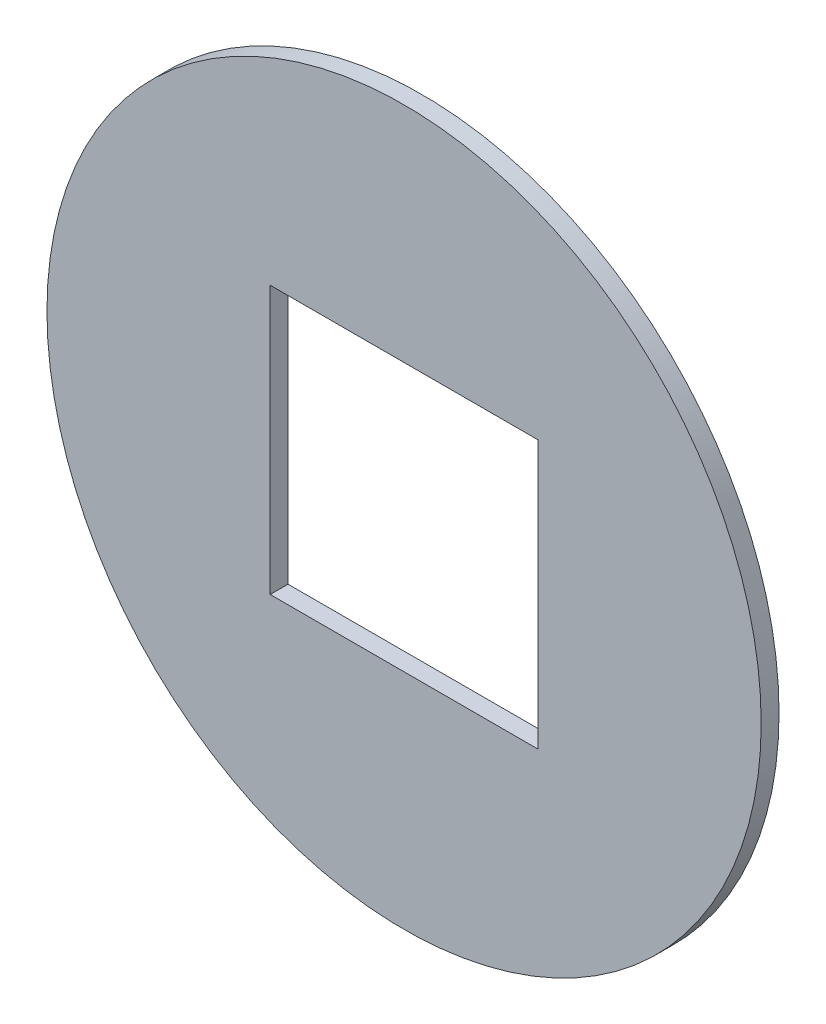
ISO-10303-21;
HEADER;
FILE_DESCRIPTION(('STEP AP214'),'2;1');
FILE_NAME('part.step','',(''),(''),'','','');
FILE_SCHEMA(('AUTOMOTIVE_DESIGN { 1 0 10303 214 1 1 1 1 }'));
ENDSEC;
DATA;
#1=APPLICATION_CONTEXT('core data for automotive mechanical design processes');
#2=APPLICATION_PROTOCOL_DEFINITION('international standard','automotive_design',2000,#1);
#3=PRODUCT_CONTEXT('',#1,'mechanical');
#4=PRODUCT('Part','Part','',(#3));
#5=PRODUCT_RELATED_PRODUCT_CATEGORY('part','',(#4));
#6=PRODUCT_DEFINITION_FORMATION('','',#4);
#7=PRODUCT_DEFINITION_CONTEXT('part definition',#1,'design');
#8=PRODUCT_DEFINITION('design','',#6,#7);
#9=PRODUCT_DEFINITION_SHAPE('','',#8);
#10=(LENGTH_UNIT() NAMED_UNIT(*) SI_UNIT(.MILLI.,.METRE.));
#11=(NAMED_UNIT(*) PLANE_ANGLE_UNIT() SI_UNIT($,.RADIAN.));
#12=(NAMED_UNIT(*) SI_UNIT($,.STERADIAN.) SOLID_ANGLE_UNIT());
#13=UNCERTAINTY_MEASURE_WITH_UNIT(LENGTH_MEASURE(1.E-05),#10,'distance_accuracy_value','');
#14=(GEOMETRIC_REPRESENTATION_CONTEXT(3) GLOBAL_UNCERTAINTY_ASSIGNED_CONTEXT((#13)) GLOBAL_UNIT_ASSIGNED_CONTEXT((#10,
#11,#12)) REPRESENTATION_CONTEXT('',''));
#15=CARTESIAN_POINT('',(0.,0.,0.));
#16=DIRECTION('',(0.,0.,1.));
#17=DIRECTION('',(1.,0.,0.));
#18=AXIS2_PLACEMENT_3D('',#15,#16,#17);
#19=CARTESIAN_POINT('',(0.,0.,0.5));
#20=DIRECTION('',(0.,0.,1.));
#21=DIRECTION('',(1.,0.,0.));
#22=AXIS2_PLACEMENT_3D('',#19,#20,#21);
#23=PLANE('',#22);
#24=CARTESIAN_POINT('',(0.,0.,0.5));
#25=DIRECTION('',(0.,0.,1.));
#26=DIRECTION('',(1.,0.,0.));
#27=AXIS2_PLACEMENT_3D('',#24,#25,#26);
#28=CIRCLE('',#27,10.);
#29=CARTESIAN_POINT('',(10.,0.,0.5));
#30=VERTEX_POINT('',#29);
#31=EDGE_CURVE('E11',#30,#30,#28,.T.);
#32=ORIENTED_EDGE('',*,*,#31,.T.);
#33=EDGE_LOOP('',(#32));
#34=FACE_BOUND('',#33,.T.);
#35=DIRECTION('',(0.,-1.,0.));
#36=VECTOR('',#35,1.);
#37=CARTESIAN_POINT('',(3.75,3.75,0.5));
#38=LINE('',#37,#36);
#39=CARTESIAN_POINT('',(3.75,3.75,0.5));
#40=VERTEX_POINT('',#39);
#41=CARTESIAN_POINT('',(3.75,-3.75,0.5));
#42=VERTEX_POINT('',#41);
#43=EDGE_CURVE('E91',#40,#42,#38,.T.);
#44=ORIENTED_EDGE('',*,*,#43,.T.);
#45=DIRECTION('',(-1.,0.,0.));
#46=VECTOR('',#45,1.);
#47=CARTESIAN_POINT('',(3.75,-3.75,0.5));
#48=LINE('',#47,#46);
#49=CARTESIAN_POINT('',(-3.75,-3.75,0.5));
#50=VERTEX_POINT('',#49);
#51=EDGE_CURVE('E56',#42,#50,#48,.T.);
#52=ORIENTED_EDGE('',*,*,#51,.T.);
#53=DIRECTION('',(0.,-1.,0.));
#54=VECTOR('',#53,1.);
#55=CARTESIAN_POINT('',(-3.75,3.75,0.5));
#56=LINE('',#55,#54);
#57=CARTESIAN_POINT('',(-3.75,3.75,0.5));
#58=VERTEX_POINT('',#57);
#59=EDGE_CURVE('E97',#58,#50,#56,.T.);
#60=ORIENTED_EDGE('',*,*,#59,.F.);
#61=DIRECTION('',(-1.,0.,0.));
#62=VECTOR('',#61,1.);
#63=CARTESIAN_POINT('',(3.75,3.75,0.5));
#64=LINE('',#63,#62);
#65=EDGE_CURVE('E108',#40,#58,#64,.T.);
#66=ORIENTED_EDGE('',*,*,#65,.F.);
#67=EDGE_LOOP('',(#44,#52,#60,#66));
#68=FACE_BOUND('',#67,.T.);
#69=ADVANCED_FACE('F41',(#34,#68),#23,.T.);
#70=CARTESIAN_POINT('',(0.,0.,0.));
#71=DIRECTION('',(0.,0.,1.));
#72=DIRECTION('',(1.,0.,0.));
#73=AXIS2_PLACEMENT_3D('',#70,#71,#72);
#74=PLANE('',#73);
#75=CARTESIAN_POINT('',(0.,0.,0.));
#76=DIRECTION('',(0.,0.,1.));
#77=DIRECTION('',(1.,0.,0.));
#78=AXIS2_PLACEMENT_3D('',#75,#76,#77);
#79=CIRCLE('',#78,10.);
#80=CARTESIAN_POINT('',(10.,0.,0.));
#81=VERTEX_POINT('',#80);
#82=EDGE_CURVE('E45',#81,#81,#79,.T.);
#83=ORIENTED_EDGE('',*,*,#82,.F.);
#84=EDGE_LOOP('',(#83));
#85=FACE_BOUND('',#84,.T.);
#86=DIRECTION('',(-1.,0.,0.));
#87=VECTOR('',#86,1.);
#88=CARTESIAN_POINT('',(3.75,-3.75,0.));
#89=LINE('',#88,#87);
#90=CARTESIAN_POINT('',(3.75,-3.75,0.));
#91=VERTEX_POINT('',#90);
#92=CARTESIAN_POINT('',(-3.75,-3.75,0.));
#93=VERTEX_POINT('',#92);
#94=EDGE_CURVE('E81',#91,#93,#89,.T.);
#95=ORIENTED_EDGE('',*,*,#94,.F.);
#96=DIRECTION('',(0.,-1.,0.));
#97=VECTOR('',#96,1.);
#98=CARTESIAN_POINT('',(3.75,3.75,0.));
#99=LINE('',#98,#97);
#100=CARTESIAN_POINT('',(3.75,3.75,0.));
#101=VERTEX_POINT('',#100);
#102=EDGE_CURVE('E102',#101,#91,#99,.T.);
#103=ORIENTED_EDGE('',*,*,#102,.F.);
#104=DIRECTION('',(-1.,0.,0.));
#105=VECTOR('',#104,1.);
#106=CARTESIAN_POINT('',(3.75,3.75,0.));
#107=LINE('',#106,#105);
#108=CARTESIAN_POINT('',(-3.75,3.75,0.));
#109=VERTEX_POINT('',#108);
#110=EDGE_CURVE('E64',#101,#109,#107,.T.);
#111=ORIENTED_EDGE('',*,*,#110,.T.);
#112=DIRECTION('',(0.,-1.,0.));
#113=VECTOR('',#112,1.);
#114=CARTESIAN_POINT('',(-3.75,3.75,0.));
#115=LINE('',#114,#113);
#116=EDGE_CURVE('E90',#109,#93,#115,.T.);
#117=ORIENTED_EDGE('',*,*,#116,.T.);
#118=EDGE_LOOP('',(#95,#103,#111,#117));
#119=FACE_BOUND('',#118,.T.);
#120=ADVANCED_FACE('F100',(#85,#119),#74,.F.);
#121=CARTESIAN_POINT('',(0.,0.,0.5));
#122=DIRECTION('',(0.,0.,-1.));
#123=DIRECTION('',(-1.,0.,0.));
#124=AXIS2_PLACEMENT_3D('',#121,#122,#123);
#125=CYLINDRICAL_SURFACE('',#124,10.);
#126=ORIENTED_EDGE('',*,*,#31,.F.);
#127=EDGE_LOOP('',(#126));
#128=FACE_BOUND('',#127,.T.);
#129=ORIENTED_EDGE('',*,*,#82,.T.);
#130=EDGE_LOOP('',(#129));
#131=FACE_BOUND('',#130,.T.);
#132=ADVANCED_FACE('F43',(#128,#131),#125,.T.);
#133=CARTESIAN_POINT('',(3.75,-3.75,0.));
#134=DIRECTION('',(0.,1.,0.));
#135=DIRECTION('',(-1.,0.,0.));
#136=AXIS2_PLACEMENT_3D('',#133,#134,#135);
#137=PLANE('',#136);
#138=ORIENTED_EDGE('',*,*,#51,.F.);
#139=DIRECTION('',(0.,0.,1.));
#140=VECTOR('',#139,1.);
#141=CARTESIAN_POINT('',(3.75,-3.75,0.));
#142=LINE('',#141,#140);
#143=EDGE_CURVE('E86',#91,#42,#142,.T.);
#144=ORIENTED_EDGE('',*,*,#143,.F.);
#145=ORIENTED_EDGE('',*,*,#94,.T.);
#146=DIRECTION('',(0.,0.,1.));
#147=VECTOR('',#146,1.);
#148=CARTESIAN_POINT('',(-3.75,-3.75,0.));
#149=LINE('',#148,#147);
#150=EDGE_CURVE('E84',#93,#50,#149,.T.);
#151=ORIENTED_EDGE('',*,*,#150,.T.);
#152=EDGE_LOOP('',(#138,#144,#145,#151));
#153=FACE_BOUND('',#152,.T.);
#154=ADVANCED_FACE('F83',(#153),#137,.T.);
#155=CARTESIAN_POINT('',(-3.75,3.75,0.));
#156=DIRECTION('',(-1.,0.,0.));
#157=DIRECTION('',(0.,-1.,0.));
#158=AXIS2_PLACEMENT_3D('',#155,#156,#157);
#159=PLANE('',#158);
#160=ORIENTED_EDGE('',*,*,#59,.T.);
#161=ORIENTED_EDGE('',*,*,#150,.F.);
#162=ORIENTED_EDGE('',*,*,#116,.F.);
#163=DIRECTION('',(0.,0.,1.));
#164=VECTOR('',#163,1.);
#165=CARTESIAN_POINT('',(-3.75,3.75,0.));
#166=LINE('',#165,#164);
#167=EDGE_CURVE('E98',#109,#58,#166,.T.);
#168=ORIENTED_EDGE('',*,*,#167,.T.);
#169=EDGE_LOOP('',(#160,#161,#162,#168));
#170=FACE_BOUND('',#169,.T.);
#171=ADVANCED_FACE('F95',(#170),#159,.F.);
#172=CARTESIAN_POINT('',(3.75,3.75,0.));
#173=DIRECTION('',(0.,1.,0.));
#174=DIRECTION('',(-1.,0.,0.));
#175=AXIS2_PLACEMENT_3D('',#172,#173,#174);
#176=PLANE('',#175);
#177=ORIENTED_EDGE('',*,*,#65,.T.);
#178=ORIENTED_EDGE('',*,*,#167,.F.);
#179=ORIENTED_EDGE('',*,*,#110,.F.);
#180=DIRECTION('',(0.,0.,1.));
#181=VECTOR('',#180,1.);
#182=CARTESIAN_POINT('',(3.75,3.75,0.));
#183=LINE('',#182,#181);
#184=EDGE_CURVE('E114',#101,#40,#183,.T.);
#185=ORIENTED_EDGE('',*,*,#184,.T.);
#186=EDGE_LOOP('',(#177,#178,#179,#185));
#187=FACE_BOUND('',#186,.T.);
#188=ADVANCED_FACE('F117',(#187),#176,.F.);
#189=CARTESIAN_POINT('',(3.75,3.75,0.));
#190=DIRECTION('',(-1.,0.,0.));
#191=DIRECTION('',(0.,-1.,0.));
#192=AXIS2_PLACEMENT_3D('',#189,#190,#191);
#193=PLANE('',#192);
#194=ORIENTED_EDGE('',*,*,#43,.F.);
#195=ORIENTED_EDGE('',*,*,#184,.F.);
#196=ORIENTED_EDGE('',*,*,#102,.T.);
#197=ORIENTED_EDGE('',*,*,#143,.T.);
#198=EDGE_LOOP('',(#194,#195,#196,#197));
#199=FACE_BOUND('',#198,.T.);
#200=ADVANCED_FACE('F121',(#199),#193,.T.);
#201=CLOSED_SHELL('',(#69,#120,#132,#154,#171,#188,#200));
#202=MANIFOLD_SOLID_BREP('B2',#201);
#203=ADVANCED_BREP_SHAPE_REPRESENTATION('',(#18,#202),#14);
#204=SHAPE_DEFINITION_REPRESENTATION(#9,#203);
ENDSEC;
END-ISO-10303-21;
